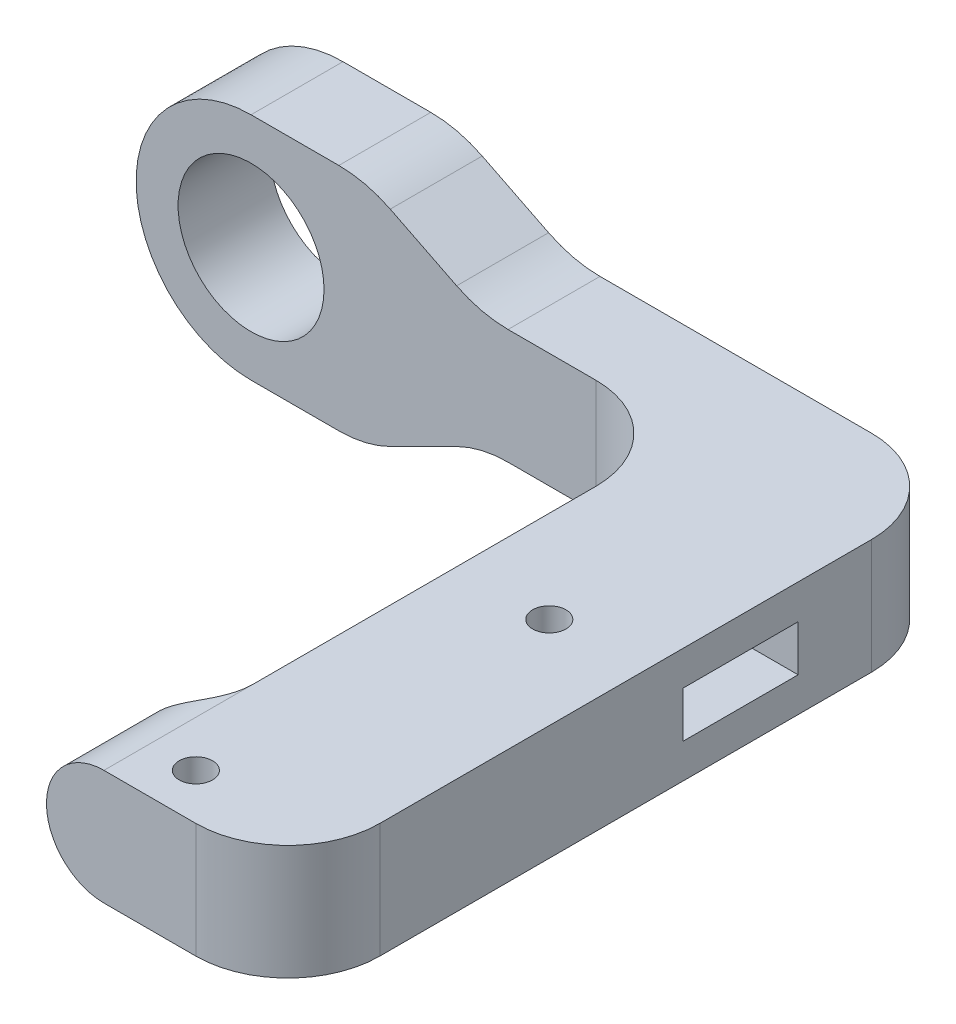
ISO-10303-21;
HEADER;
FILE_DESCRIPTION(('STEP AP214'),'2;1');
FILE_NAME('part.step','',(''),(''),'','','');
FILE_SCHEMA(('AUTOMOTIVE_DESIGN { 1 0 10303 214 1 1 1 1 }'));
ENDSEC;
DATA;
#1=APPLICATION_CONTEXT('core data for automotive mechanical design processes');
#2=APPLICATION_PROTOCOL_DEFINITION('international standard','automotive_design',2000,#1);
#3=PRODUCT_CONTEXT('',#1,'mechanical');
#4=PRODUCT('Part','Part','',(#3));
#5=PRODUCT_RELATED_PRODUCT_CATEGORY('part','',(#4));
#6=PRODUCT_DEFINITION_FORMATION('','',#4);
#7=PRODUCT_DEFINITION_CONTEXT('part definition',#1,'design');
#8=PRODUCT_DEFINITION('design','',#6,#7);
#9=PRODUCT_DEFINITION_SHAPE('','',#8);
#10=(LENGTH_UNIT() NAMED_UNIT(*) SI_UNIT(.MILLI.,.METRE.));
#11=(NAMED_UNIT(*) PLANE_ANGLE_UNIT() SI_UNIT($,.RADIAN.));
#12=(NAMED_UNIT(*) SI_UNIT($,.STERADIAN.) SOLID_ANGLE_UNIT());
#13=UNCERTAINTY_MEASURE_WITH_UNIT(LENGTH_MEASURE(1.E-05),#10,'distance_accuracy_value','');
#14=(GEOMETRIC_REPRESENTATION_CONTEXT(3) GLOBAL_UNCERTAINTY_ASSIGNED_CONTEXT((#13)) GLOBAL_UNIT_ASSIGNED_CONTEXT((#10,
#11,#12)) REPRESENTATION_CONTEXT('',''));
#15=CARTESIAN_POINT('',(0.,0.,0.));
#16=DIRECTION('',(0.,0.,1.));
#17=DIRECTION('',(1.,0.,0.));
#18=AXIS2_PLACEMENT_3D('',#15,#16,#17);
#19=CARTESIAN_POINT('',(-8.,5.,58.8));
#20=DIRECTION('',(1.,0.,0.));
#21=DIRECTION('',(0.,1.,0.));
#22=AXIS2_PLACEMENT_3D('',#19,#20,#21);
#23=PLANE('',#22);
#24=DIRECTION('',(0.,0.,-1.));
#25=VECTOR('',#24,1.);
#26=CARTESIAN_POINT('',(-8.,5.,58.8));
#27=LINE('',#26,#25);
#28=CARTESIAN_POINT('',(-8.,5.,45.8));
#29=VERTEX_POINT('',#28);
#30=CARTESIAN_POINT('',(-8.,5.,16.));
#31=VERTEX_POINT('',#30);
#32=EDGE_CURVE('E346',#29,#31,#27,.T.);
#33=ORIENTED_EDGE('',*,*,#32,.T.);
#34=DIRECTION('',(0.,1.,0.));
#35=VECTOR('',#34,1.);
#36=CARTESIAN_POINT('',(-8.,-5.,16.));
#37=LINE('',#36,#35);
#38=CARTESIAN_POINT('',(-8.,2.,16.));
#39=VERTEX_POINT('',#38);
#40=EDGE_CURVE('E564',#31,#39,#37,.F.);
#41=ORIENTED_EDGE('',*,*,#40,.T.);
#42=DIRECTION('',(0.,0.,-1.));
#43=VECTOR('',#42,1.);
#44=CARTESIAN_POINT('',(-8.,2.,14.4));
#45=LINE('',#44,#43);
#46=CARTESIAN_POINT('',(-8.,2.,24.4));
#47=VERTEX_POINT('',#46);
#48=EDGE_CURVE('E221',#47,#39,#45,.T.);
#49=ORIENTED_EDGE('',*,*,#48,.F.);
#50=DIRECTION('',(0.,1.,0.));
#51=VECTOR('',#50,1.);
#52=CARTESIAN_POINT('',(-8.,2.,24.4));
#53=LINE('',#52,#51);
#54=CARTESIAN_POINT('',(-8.,-2.,24.4));
#55=VERTEX_POINT('',#54);
#56=EDGE_CURVE('E225',#55,#47,#53,.T.);
#57=ORIENTED_EDGE('',*,*,#56,.F.);
#58=DIRECTION('',(0.,0.,1.));
#59=VECTOR('',#58,1.);
#60=CARTESIAN_POINT('',(-8.,-2.,14.4));
#61=LINE('',#60,#59);
#62=CARTESIAN_POINT('',(-8.,-2.,16.));
#63=VERTEX_POINT('',#62);
#64=EDGE_CURVE('E232',#63,#55,#61,.T.);
#65=ORIENTED_EDGE('',*,*,#64,.F.);
#66=DIRECTION('',(0.,1.,0.));
#67=VECTOR('',#66,1.);
#68=CARTESIAN_POINT('',(-8.,-5.,16.));
#69=LINE('',#68,#67);
#70=CARTESIAN_POINT('',(-8.,-5.,16.));
#71=VERTEX_POINT('',#70);
#72=EDGE_CURVE('E561',#63,#71,#69,.F.);
#73=ORIENTED_EDGE('',*,*,#72,.T.);
#74=DIRECTION('',(0.,0.,-1.));
#75=VECTOR('',#74,1.);
#76=CARTESIAN_POINT('',(-8.,-5.,58.8));
#77=LINE('',#76,#75);
#78=CARTESIAN_POINT('',(-8.,-5.,45.8));
#79=VERTEX_POINT('',#78);
#80=EDGE_CURVE('E342',#79,#71,#77,.T.);
#81=ORIENTED_EDGE('',*,*,#80,.F.);
#82=DIRECTION('',(0.,1.,0.));
#83=VECTOR('',#82,1.);
#84=CARTESIAN_POINT('',(-8.,5.,45.8));
#85=LINE('',#84,#83);
#86=EDGE_CURVE('E433',#79,#29,#85,.T.);
#87=ORIENTED_EDGE('',*,*,#86,.T.);
#88=EDGE_LOOP('',(#33,#41,#49,#57,#65,#73,#81,#87));
#89=FACE_BOUND('',#88,.T.);
#90=ADVANCED_FACE('F41',(#89),#23,.F.);
#91=CARTESIAN_POINT('',(8.,5.,58.8));
#92=DIRECTION('',(0.,-1.,0.));
#93=DIRECTION('',(1.,0.,0.));
#94=AXIS2_PLACEMENT_3D('',#91,#92,#93);
#95=PLANE('',#94);
#96=CARTESIAN_POINT('',(0.,5.,28.05));
#97=DIRECTION('',(0.,1.,0.));
#98=DIRECTION('',(-1.,0.,0.));
#99=AXIS2_PLACEMENT_3D('',#96,#97,#98);
#100=CIRCLE('',#99,1.45);
#101=CARTESIAN_POINT('',(-1.45,5.,28.05));
#102=VERTEX_POINT('',#101);
#103=EDGE_CURVE('E240',#102,#102,#100,.T.);
#104=ORIENTED_EDGE('',*,*,#103,.F.);
#105=EDGE_LOOP('',(#104));
#106=FACE_BOUND('',#105,.T.);
#107=CARTESIAN_POINT('',(-4.,5.,54.8));
#108=DIRECTION('',(0.,-1.,0.));
#109=DIRECTION('',(1.,0.,0.));
#110=AXIS2_PLACEMENT_3D('',#107,#108,#109);
#111=CIRCLE('',#110,1.45);
#112=CARTESIAN_POINT('',(-2.55,5.,54.8));
#113=VERTEX_POINT('',#112);
#114=EDGE_CURVE('E254',#113,#113,#111,.T.);
#115=ORIENTED_EDGE('',*,*,#114,.T.);
#116=EDGE_LOOP('',(#115));
#117=FACE_BOUND('',#116,.T.);
#118=DIRECTION('',(-1.,0.,0.));
#119=VECTOR('',#118,1.);
#120=CARTESIAN_POINT('',(8.,5.,0.));
#121=LINE('',#120,#119);
#122=CARTESIAN_POINT('',(0.,5.,0.));
#123=VERTEX_POINT('',#122);
#124=CARTESIAN_POINT('',(-23.6393202250021,5.,0.));
#125=VERTEX_POINT('',#124);
#126=EDGE_CURVE('E320',#123,#125,#121,.T.);
#127=ORIENTED_EDGE('',*,*,#126,.T.);
#128=DIRECTION('',(0.,0.,-1.));
#129=VECTOR('',#128,1.);
#130=CARTESIAN_POINT('',(-23.6393202250021,5.,8.));
#131=LINE('',#130,#129);
#132=CARTESIAN_POINT('',(-23.6393202250021,5.,8.));
#133=VERTEX_POINT('',#132);
#134=EDGE_CURVE('E417',#125,#133,#131,.F.);
#135=ORIENTED_EDGE('',*,*,#134,.T.);
#136=DIRECTION('',(-1.,0.,0.));
#137=VECTOR('',#136,1.);
#138=CARTESIAN_POINT('',(-26.,5.,8.));
#139=LINE('',#138,#137);
#140=CARTESIAN_POINT('',(-16.,5.,8.));
#141=VERTEX_POINT('',#140);
#142=EDGE_CURVE('E267',#141,#133,#139,.T.);
#143=ORIENTED_EDGE('',*,*,#142,.F.);
#144=CARTESIAN_POINT('',(-16.,5.,16.));
#145=DIRECTION('',(0.,-1.,0.));
#146=DIRECTION('',(1.,0.,0.));
#147=AXIS2_PLACEMENT_3D('',#144,#145,#146);
#148=CIRCLE('',#147,8.);
#149=EDGE_CURVE('E559',#141,#31,#148,.T.);
#150=ORIENTED_EDGE('',*,*,#149,.T.);
#151=ORIENTED_EDGE('',*,*,#32,.F.);
#152=CARTESIAN_POINT('',(-8.,5.,58.8));
#153=VERTEX_POINT('',#152);
#154=EDGE_CURVE('E347',#153,#29,#27,.T.);
#155=ORIENTED_EDGE('',*,*,#154,.F.);
#156=DIRECTION('',(-1.,0.,0.));
#157=VECTOR('',#156,1.);
#158=CARTESIAN_POINT('',(8.,5.,58.8));
#159=LINE('',#158,#157);
#160=CARTESIAN_POINT('',(0.,5.,58.8));
#161=VERTEX_POINT('',#160);
#162=EDGE_CURVE('E321',#161,#153,#159,.T.);
#163=ORIENTED_EDGE('',*,*,#162,.F.);
#164=CARTESIAN_POINT('',(0.,5.,50.8));
#165=DIRECTION('',(0.,-1.,0.));
#166=DIRECTION('',(1.,0.,0.));
#167=AXIS2_PLACEMENT_3D('',#164,#165,#166);
#168=CIRCLE('',#167,8.);
#169=CARTESIAN_POINT('',(8.,5.,50.8));
#170=VERTEX_POINT('',#169);
#171=EDGE_CURVE('E360',#161,#170,#168,.F.);
#172=ORIENTED_EDGE('',*,*,#171,.T.);
#173=DIRECTION('',(0.,0.,-1.));
#174=VECTOR('',#173,1.);
#175=CARTESIAN_POINT('',(8.,5.,58.8));
#176=LINE('',#175,#174);
#177=CARTESIAN_POINT('',(8.,5.,8.));
#178=VERTEX_POINT('',#177);
#179=EDGE_CURVE('E329',#170,#178,#176,.T.);
#180=ORIENTED_EDGE('',*,*,#179,.T.);
#181=CARTESIAN_POINT('',(0.,5.,8.));
#182=DIRECTION('',(0.,-1.,0.));
#183=DIRECTION('',(1.,0.,0.));
#184=AXIS2_PLACEMENT_3D('',#181,#182,#183);
#185=CIRCLE('',#184,8.);
#186=EDGE_CURVE('E363',#178,#123,#185,.F.);
#187=ORIENTED_EDGE('',*,*,#186,.T.);
#188=EDGE_LOOP('',(#127,#135,#143,#150,#151,#155,#163,#172,#180,#187));
#189=FACE_BOUND('',#188,.T.);
#190=ADVANCED_FACE('F477',(#106,#117,#189),#95,.F.);
#191=CARTESIAN_POINT('',(-8.,-5.,58.8));
#192=DIRECTION('',(0.,1.,0.));
#193=DIRECTION('',(-1.,0.,0.));
#194=AXIS2_PLACEMENT_3D('',#191,#192,#193);
#195=PLANE('',#194);
#196=CARTESIAN_POINT('',(0.,-5.,28.05));
#197=DIRECTION('',(0.,1.,0.));
#198=DIRECTION('',(-1.,0.,0.));
#199=AXIS2_PLACEMENT_3D('',#196,#197,#198);
#200=CIRCLE('',#199,1.45);
#201=CARTESIAN_POINT('',(-1.45,-5.,28.05));
#202=VERTEX_POINT('',#201);
#203=EDGE_CURVE('E249',#202,#202,#200,.T.);
#204=ORIENTED_EDGE('',*,*,#203,.T.);
#205=EDGE_LOOP('',(#204));
#206=FACE_BOUND('',#205,.T.);
#207=CARTESIAN_POINT('',(-4.,-5.,54.8));
#208=DIRECTION('',(0.,-1.,0.));
#209=DIRECTION('',(1.,0.,0.));
#210=AXIS2_PLACEMENT_3D('',#207,#208,#209);
#211=CIRCLE('',#210,1.45);
#212=CARTESIAN_POINT('',(-2.55,-5.,54.8));
#213=VERTEX_POINT('',#212);
#214=EDGE_CURVE('E250',#213,#213,#211,.T.);
#215=ORIENTED_EDGE('',*,*,#214,.F.);
#216=EDGE_LOOP('',(#215));
#217=FACE_BOUND('',#216,.T.);
#218=DIRECTION('',(1.,0.,0.));
#219=VECTOR('',#218,1.);
#220=CARTESIAN_POINT('',(-8.,-5.,8.));
#221=LINE('',#220,#219);
#222=CARTESIAN_POINT('',(-23.6393202250021,-5.,8.));
#223=VERTEX_POINT('',#222);
#224=CARTESIAN_POINT('',(-16.,-5.,8.));
#225=VERTEX_POINT('',#224);
#226=EDGE_CURVE('E289',#223,#225,#221,.T.);
#227=ORIENTED_EDGE('',*,*,#226,.F.);
#228=DIRECTION('',(0.,0.,-1.));
#229=VECTOR('',#228,1.);
#230=CARTESIAN_POINT('',(-23.6393202250021,-5.,0.));
#231=LINE('',#230,#229);
#232=CARTESIAN_POINT('',(-23.6393202250021,-5.,0.));
#233=VERTEX_POINT('',#232);
#234=EDGE_CURVE('E402',#223,#233,#231,.T.);
#235=ORIENTED_EDGE('',*,*,#234,.T.);
#236=DIRECTION('',(1.,0.,0.));
#237=VECTOR('',#236,1.);
#238=CARTESIAN_POINT('',(-8.,-5.,0.));
#239=LINE('',#238,#237);
#240=CARTESIAN_POINT('',(0.,-5.,0.));
#241=VERTEX_POINT('',#240);
#242=EDGE_CURVE('E325',#233,#241,#239,.T.);
#243=ORIENTED_EDGE('',*,*,#242,.T.);
#244=CARTESIAN_POINT('',(0.,-5.,8.));
#245=DIRECTION('',(0.,1.,0.));
#246=DIRECTION('',(-1.,0.,0.));
#247=AXIS2_PLACEMENT_3D('',#244,#245,#246);
#248=CIRCLE('',#247,8.);
#249=CARTESIAN_POINT('',(8.,-5.,8.));
#250=VERTEX_POINT('',#249);
#251=EDGE_CURVE('E373',#241,#250,#248,.F.);
#252=ORIENTED_EDGE('',*,*,#251,.T.);
#253=DIRECTION('',(0.,0.,-1.));
#254=VECTOR('',#253,1.);
#255=CARTESIAN_POINT('',(8.,-5.,58.8));
#256=LINE('',#255,#254);
#257=CARTESIAN_POINT('',(8.,-5.,50.8));
#258=VERTEX_POINT('',#257);
#259=EDGE_CURVE('E338',#258,#250,#256,.T.);
#260=ORIENTED_EDGE('',*,*,#259,.F.);
#261=CARTESIAN_POINT('',(0.,-5.,50.8));
#262=DIRECTION('',(0.,1.,0.));
#263=DIRECTION('',(-1.,0.,0.));
#264=AXIS2_PLACEMENT_3D('',#261,#262,#263);
#265=CIRCLE('',#264,8.);
#266=CARTESIAN_POINT('',(0.,-5.,58.8));
#267=VERTEX_POINT('',#266);
#268=EDGE_CURVE('E370',#258,#267,#265,.F.);
#269=ORIENTED_EDGE('',*,*,#268,.T.);
#270=DIRECTION('',(1.,0.,0.));
#271=VECTOR('',#270,1.);
#272=CARTESIAN_POINT('',(-8.,-5.,58.8));
#273=LINE('',#272,#271);
#274=CARTESIAN_POINT('',(-8.,-5.,58.8));
#275=VERTEX_POINT('',#274);
#276=EDGE_CURVE('E324',#275,#267,#273,.T.);
#277=ORIENTED_EDGE('',*,*,#276,.F.);
#278=EDGE_CURVE('E343',#275,#79,#77,.T.);
#279=ORIENTED_EDGE('',*,*,#278,.T.);
#280=ORIENTED_EDGE('',*,*,#80,.T.);
#281=CARTESIAN_POINT('',(-16.,-5.,16.));
#282=DIRECTION('',(0.,1.,0.));
#283=DIRECTION('',(-1.,0.,0.));
#284=AXIS2_PLACEMENT_3D('',#281,#282,#283);
#285=CIRCLE('',#284,8.);
#286=EDGE_CURVE('E11',#71,#225,#285,.T.);
#287=ORIENTED_EDGE('',*,*,#286,.T.);
#288=EDGE_LOOP('',(#227,#235,#243,#252,#260,#269,#277,#279,#280,#287));
#289=FACE_BOUND('',#288,.T.);
#290=ADVANCED_FACE('F474',(#206,#217,#289),#195,.F.);
#291=CARTESIAN_POINT('',(8.,-5.,58.8));
#292=DIRECTION('',(-1.,0.,0.));
#293=DIRECTION('',(0.,0.,1.));
#294=AXIS2_PLACEMENT_3D('',#291,#292,#293);
#295=PLANE('',#294);
#296=DIRECTION('',(0.,0.,-1.));
#297=VECTOR('',#296,1.);
#298=CARTESIAN_POINT('',(8.,2.,14.4));
#299=LINE('',#298,#297);
#300=CARTESIAN_POINT('',(8.,2.,24.4));
#301=VERTEX_POINT('',#300);
#302=CARTESIAN_POINT('',(8.,2.,14.4));
#303=VERTEX_POINT('',#302);
#304=EDGE_CURVE('E205',#301,#303,#299,.T.);
#305=ORIENTED_EDGE('',*,*,#304,.T.);
#306=DIRECTION('',(0.,-1.,0.));
#307=VECTOR('',#306,1.);
#308=CARTESIAN_POINT('',(8.,2.,14.4));
#309=LINE('',#308,#307);
#310=CARTESIAN_POINT('',(8.,-2.,14.4));
#311=VERTEX_POINT('',#310);
#312=EDGE_CURVE('E198',#303,#311,#309,.T.);
#313=ORIENTED_EDGE('',*,*,#312,.T.);
#314=DIRECTION('',(0.,0.,1.));
#315=VECTOR('',#314,1.);
#316=CARTESIAN_POINT('',(8.,-2.,14.4));
#317=LINE('',#316,#315);
#318=CARTESIAN_POINT('',(8.,-2.,24.4));
#319=VERTEX_POINT('',#318);
#320=EDGE_CURVE('E209',#311,#319,#317,.T.);
#321=ORIENTED_EDGE('',*,*,#320,.T.);
#322=DIRECTION('',(0.,1.,0.));
#323=VECTOR('',#322,1.);
#324=CARTESIAN_POINT('',(8.,2.,24.4));
#325=LINE('',#324,#323);
#326=EDGE_CURVE('E215',#319,#301,#325,.T.);
#327=ORIENTED_EDGE('',*,*,#326,.T.);
#328=EDGE_LOOP('',(#305,#313,#321,#327));
#329=FACE_BOUND('',#328,.T.);
#330=ORIENTED_EDGE('',*,*,#259,.T.);
#331=DIRECTION('',(0.,1.,0.));
#332=VECTOR('',#331,1.);
#333=CARTESIAN_POINT('',(8.,-5.,8.));
#334=LINE('',#333,#332);
#335=EDGE_CURVE('E356',#250,#178,#334,.T.);
#336=ORIENTED_EDGE('',*,*,#335,.T.);
#337=ORIENTED_EDGE('',*,*,#179,.F.);
#338=DIRECTION('',(0.,1.,0.));
#339=VECTOR('',#338,1.);
#340=CARTESIAN_POINT('',(8.,-5.,50.8));
#341=LINE('',#340,#339);
#342=EDGE_CURVE('E350',#170,#258,#341,.F.);
#343=ORIENTED_EDGE('',*,*,#342,.T.);
#344=EDGE_LOOP('',(#330,#336,#337,#343));
#345=FACE_BOUND('',#344,.T.);
#346=ADVANCED_FACE('F217',(#329,#345),#295,.F.);
#347=CARTESIAN_POINT('',(0.,0.,58.8));
#348=DIRECTION('',(0.,0.,1.));
#349=DIRECTION('',(1.,0.,0.));
#350=AXIS2_PLACEMENT_3D('',#347,#348,#349);
#351=PLANE('',#350);
#352=ORIENTED_EDGE('',*,*,#276,.T.);
#353=DIRECTION('',(0.,1.,0.));
#354=VECTOR('',#353,1.);
#355=CARTESIAN_POINT('',(0.,5.,58.8));
#356=LINE('',#355,#354);
#357=EDGE_CURVE('E376',#267,#161,#356,.T.);
#358=ORIENTED_EDGE('',*,*,#357,.T.);
#359=ORIENTED_EDGE('',*,*,#162,.T.);
#360=CARTESIAN_POINT('',(-8.,0.,58.8));
#361=DIRECTION('',(0.,0.,1.));
#362=DIRECTION('',(1.,0.,0.));
#363=AXIS2_PLACEMENT_3D('',#360,#361,#362);
#364=CIRCLE('',#363,5.);
#365=EDGE_CURVE('E317',#153,#275,#364,.T.);
#366=ORIENTED_EDGE('',*,*,#365,.T.);
#367=EDGE_LOOP('',(#352,#358,#359,#366));
#368=FACE_BOUND('',#367,.T.);
#369=ADVANCED_FACE('F464',(#368),#351,.T.);
#370=CARTESIAN_POINT('',(0.,0.,0.));
#371=DIRECTION('',(0.,0.,1.));
#372=DIRECTION('',(1.,0.,0.));
#373=AXIS2_PLACEMENT_3D('',#370,#371,#372);
#374=PLANE('',#373);
#375=DIRECTION('',(0.894427190999916,0.447213595499958,0.));
#376=VECTOR('',#375,1.);
#377=CARTESIAN_POINT('',(-26.,-5.,0.));
#378=LINE('',#377,#376);
#379=CARTESIAN_POINT('',(-33.8885438199983,-8.94427190999916,0.));
#380=VERTEX_POINT('',#379);
#381=CARTESIAN_POINT('',(-28.1114561800017,-6.05572809000084,0.));
#382=VERTEX_POINT('',#381);
#383=EDGE_CURVE('E271',#380,#382,#378,.T.);
#384=ORIENTED_EDGE('',*,*,#383,.F.);
#385=CARTESIAN_POINT('',(-38.3606797749979,0.,0.));
#386=DIRECTION('',(0.,0.,1.));
#387=DIRECTION('',(1.,0.,0.));
#388=AXIS2_PLACEMENT_3D('',#385,#386,#387);
#389=CIRCLE('',#388,10.);
#390=CARTESIAN_POINT('',(-38.3606797749979,-10.,0.));
#391=VERTEX_POINT('',#390);
#392=EDGE_CURVE('E390',#380,#391,#389,.F.);
#393=ORIENTED_EDGE('',*,*,#392,.T.);
#394=DIRECTION('',(1.,0.,0.));
#395=VECTOR('',#394,1.);
#396=CARTESIAN_POINT('',(-36.,-10.,0.));
#397=LINE('',#396,#395);
#398=CARTESIAN_POINT('',(-46.,-10.,0.));
#399=VERTEX_POINT('',#398);
#400=EDGE_CURVE('E303',#399,#391,#397,.T.);
#401=ORIENTED_EDGE('',*,*,#400,.F.);
#402=CARTESIAN_POINT('',(-46.,0.,0.));
#403=DIRECTION('',(0.,0.,1.));
#404=DIRECTION('',(-1.,0.,0.));
#405=AXIS2_PLACEMENT_3D('',#402,#403,#404);
#406=CIRCLE('',#405,10.);
#407=CARTESIAN_POINT('',(-46.,10.,0.));
#408=VERTEX_POINT('',#407);
#409=EDGE_CURVE('E300',#408,#399,#406,.T.);
#410=ORIENTED_EDGE('',*,*,#409,.F.);
#411=DIRECTION('',(-1.,0.,0.));
#412=VECTOR('',#411,1.);
#413=CARTESIAN_POINT('',(-46.,10.,0.));
#414=LINE('',#413,#412);
#415=CARTESIAN_POINT('',(-38.3606797749979,10.,0.));
#416=VERTEX_POINT('',#415);
#417=EDGE_CURVE('E297',#416,#408,#414,.T.);
#418=ORIENTED_EDGE('',*,*,#417,.F.);
#419=CARTESIAN_POINT('',(-38.3606797749979,0.,0.));
#420=DIRECTION('',(0.,0.,1.));
#421=DIRECTION('',(1.,0.,0.));
#422=AXIS2_PLACEMENT_3D('',#419,#420,#421);
#423=CIRCLE('',#422,10.);
#424=CARTESIAN_POINT('',(-33.8885438199983,8.94427190999916,0.));
#425=VERTEX_POINT('',#424);
#426=EDGE_CURVE('E387',#416,#425,#423,.F.);
#427=ORIENTED_EDGE('',*,*,#426,.T.);
#428=DIRECTION('',(-0.894427190999916,0.447213595499958,0.));
#429=VECTOR('',#428,1.);
#430=CARTESIAN_POINT('',(-36.,10.,0.));
#431=LINE('',#430,#429);
#432=CARTESIAN_POINT('',(-28.1114561800017,6.05572809000084,0.));
#433=VERTEX_POINT('',#432);
#434=EDGE_CURVE('E263',#433,#425,#431,.T.);
#435=ORIENTED_EDGE('',*,*,#434,.F.);
#436=CARTESIAN_POINT('',(-23.6393202250021,15.,0.));
#437=DIRECTION('',(0.,0.,1.));
#438=DIRECTION('',(1.,0.,0.));
#439=AXIS2_PLACEMENT_3D('',#436,#437,#438);
#440=CIRCLE('',#439,10.);
#441=EDGE_CURVE('E427',#433,#125,#440,.T.);
#442=ORIENTED_EDGE('',*,*,#441,.T.);
#443=ORIENTED_EDGE('',*,*,#126,.F.);
#444=DIRECTION('',(0.,1.,0.));
#445=VECTOR('',#444,1.);
#446=CARTESIAN_POINT('',(0.,0.,0.));
#447=LINE('',#446,#445);
#448=EDGE_CURVE('E366',#123,#241,#447,.F.);
#449=ORIENTED_EDGE('',*,*,#448,.T.);
#450=ORIENTED_EDGE('',*,*,#242,.F.);
#451=CARTESIAN_POINT('',(-23.6393202250021,-15.,0.));
#452=DIRECTION('',(0.,0.,1.));
#453=DIRECTION('',(1.,0.,0.));
#454=AXIS2_PLACEMENT_3D('',#451,#452,#453);
#455=CIRCLE('',#454,10.);
#456=EDGE_CURVE('E421',#233,#382,#455,.T.);
#457=ORIENTED_EDGE('',*,*,#456,.T.);
#458=EDGE_LOOP('',(#384,#393,#401,#410,#418,#427,#435,#442,#443,#449,#450,#457));
#459=FACE_BOUND('',#458,.T.);
#460=CARTESIAN_POINT('',(-46.,0.,0.));
#461=DIRECTION('',(0.,0.,1.));
#462=DIRECTION('',(1.,0.,0.));
#463=AXIS2_PLACEMENT_3D('',#460,#461,#462);
#464=CIRCLE('',#463,6.35);
#465=CARTESIAN_POINT('',(-39.65,0.,0.));
#466=VERTEX_POINT('',#465);
#467=EDGE_CURVE('E258',#466,#466,#464,.T.);
#468=ORIENTED_EDGE('',*,*,#467,.T.);
#469=EDGE_LOOP('',(#468));
#470=FACE_BOUND('',#469,.T.);
#471=ADVANCED_FACE('F460',(#459,#470),#374,.F.);
#472=CARTESIAN_POINT('',(-8.,0.,50.8));
#473=DIRECTION('',(0.,0.,1.));
#474=DIRECTION('',(1.,0.,0.));
#475=AXIS2_PLACEMENT_3D('',#472,#473,#474);
#476=CYLINDRICAL_SURFACE('',#475,5.);
#477=ORIENTED_EDGE('',*,*,#365,.F.);
#478=ORIENTED_EDGE('',*,*,#154,.T.);
#479=CARTESIAN_POINT('',(-8.,5.,45.8));
#480=CARTESIAN_POINT('',(-7.99998549865912,4.99995708928931,45.9391879787734));
#481=CARTESIAN_POINT('',(-8.00581138983767,4.99999864882734,46.0783739228776));
#482=CARTESIAN_POINT('',(-8.02903963200686,4.99994062123228,46.3557758500301));
#483=CARTESIAN_POINT('',(-8.04644191251777,4.99984103495851,46.4939918389787));
#484=CARTESIAN_POINT('',(-8.09275930521255,4.99919006365314,46.7687310698582));
#485=CARTESIAN_POINT('',(-8.12169461183642,4.9986378843255,46.905250907126));
#486=CARTESIAN_POINT('',(-8.19086848348578,4.996476137854,47.1753873611374));
#487=CARTESIAN_POINT('',(-8.23110690226101,4.99486658439107,47.3090040154209));
#488=CARTESIAN_POINT('',(-8.32264864538949,4.98978938304454,47.572530042192));
#489=CARTESIAN_POINT('',(-8.37396450241427,4.9863196239305,47.7024350253419));
#490=CARTESIAN_POINT('',(-8.48723476243144,4.97652815328975,47.9574074744933));
#491=CARTESIAN_POINT('',(-8.54918850141326,4.97020661972915,48.0824752418345));
#492=CARTESIAN_POINT('',(-8.68315966172483,4.95356877124832,48.3267119328362));
#493=CARTESIAN_POINT('',(-8.75516960927405,4.94325541306139,48.4458851490634));
#494=CARTESIAN_POINT('',(-8.90858386337488,4.91736953591812,48.6774285153913));
#495=CARTESIAN_POINT('',(-8.98998756699145,4.9017973543741,48.7897991014114));
#496=CARTESIAN_POINT('',(-9.15792167683925,4.86480378516127,49.0025106218988));
#497=CARTESIAN_POINT('',(-9.24412940638407,4.84363353690537,49.1031494887471));
#498=CARTESIAN_POINT('',(-9.42328020163076,4.79404906757774,49.2963444735722));
#499=CARTESIAN_POINT('',(-9.51622311302345,4.76563501243073,49.3889007766207));
#500=CARTESIAN_POINT('',(-9.70736024185754,4.70054216638891,49.5650218148149));
#501=CARTESIAN_POINT('',(-9.80554764526215,4.66387390989617,49.6485978119416));
#502=CARTESIAN_POINT('',(-10.0056361856532,4.58138854271999,49.8062449254303));
#503=CARTESIAN_POINT('',(-10.1075366737801,4.53557302430703,49.8803176923454));
#504=CARTESIAN_POINT('',(-10.2991617243025,4.44113303338272,50.0091490334789));
#505=CARTESIAN_POINT('',(-10.3886532003845,4.39374216508619,50.0651640543257));
#506=CARTESIAN_POINT('',(-10.5677399064932,4.29154236529258,50.1697667219308));
#507=CARTESIAN_POINT('',(-10.6573351302206,4.23673386293922,50.2183547980254));
#508=CARTESIAN_POINT('',(-10.8353474522524,4.11972699368197,50.3082397204842));
#509=CARTESIAN_POINT('',(-10.9237645166673,4.05752841471128,50.3495363575274));
#510=CARTESIAN_POINT('',(-11.0981974394701,3.92595291858719,50.4251687234696));
#511=CARTESIAN_POINT('',(-11.1842132837869,3.85657595937933,50.4595044115843));
#512=CARTESIAN_POINT('',(-11.3478218826094,3.71525064571076,50.51990104921));
#513=CARTESIAN_POINT('',(-11.4256134585556,3.64368725115055,50.5463274091128));
#514=CARTESIAN_POINT('',(-11.5773018258489,3.49488245998301,50.5939809302777));
#515=CARTESIAN_POINT('',(-11.6511973650553,3.41763925682175,50.6152064279413));
#516=CARTESIAN_POINT('',(-11.794368300347,3.25795449384787,50.6530336014394));
#517=CARTESIAN_POINT('',(-11.8636446089345,3.17551396703402,50.6696361925727));
#518=CARTESIAN_POINT('',(-11.9970545396344,3.00586200428445,50.6988535509665));
#519=CARTESIAN_POINT('',(-12.0611862797283,2.91864884184294,50.7114668637648));
#520=CARTESIAN_POINT('',(-12.1898665571314,2.73115121408323,50.7344064746668));
#521=CARTESIAN_POINT('',(-12.2538341560647,2.63042531223544,50.7443852138641));
#522=CARTESIAN_POINT('',(-12.3745249511924,2.42441584466993,50.7610981799036));
#523=CARTESIAN_POINT('',(-12.4312449482745,2.31913029357588,50.767830977589));
#524=CARTESIAN_POINT('',(-12.5370635071989,2.10460607417449,50.778807276559));
#525=CARTESIAN_POINT('',(-12.5861580592973,1.99536536307359,50.7830494714289));
#526=CARTESIAN_POINT('',(-12.6763984031589,1.77359308457622,50.7897223113021));
#527=CARTESIAN_POINT('',(-12.7175437095436,1.66106131671164,50.7921528457119));
#528=CARTESIAN_POINT('',(-12.7951642259386,1.4225268270473,50.7959680839854));
#529=CARTESIAN_POINT('',(-12.8308283041114,1.29625752473594,50.7972319650804));
#530=CARTESIAN_POINT('',(-12.8921266534371,1.0412939494122,50.7989296006095));
#531=CARTESIAN_POINT('',(-12.9177600314134,0.912599461519848,50.7993632811324));
#532=CARTESIAN_POINT('',(-12.9588208606717,0.653653996306247,50.7998750748702));
#533=CARTESIAN_POINT('',(-12.9742531266453,0.523403782847282,50.7999533559281));
#534=CARTESIAN_POINT('',(-12.9948481131185,0.262102720855087,50.7999989093315));
#535=CARTESIAN_POINT('',(-13.000011504189,0.131051925161548,50.7999661889261));
#536=CARTESIAN_POINT('',(-13.,0.,50.8));
#537=B_SPLINE_CURVE_WITH_KNOTS('',3,(#479,#480,#481,#482,#483,#484,#485,#486,#487,#488,#489,
#490,#491,#492,#493,#494,#495,#496,#497,#498,#499,#500,#501,#502,#503,#504,#505,#506,#507,#508,
#509,#510,#511,#512,#513,#514,#515,#516,#517,#518,#519,#520,#521,#522,#523,#524,#525,#526,#527,
#528,#529,#530,#531,#532,#533,#534,#535,#536),.UNSPECIFIED.,.F.,.F.,(4,2,2,2,2,2,2,2,2,2,2,2,2,
2,2,2,2,2,2,2,2,2,2,2,2,2,2,2,4),(0.,0.417439173640649,0.834875805838476,1.25304660748524,
1.67121199869516,2.08985299230127,2.50846786406668,2.92677326051622,3.34505182309423,
3.7470569021807,4.14905277387271,4.55053847926641,4.95195435859015,5.29866782167456,
5.6453612343828,5.99206459826368,6.33876999341715,6.66528709743992,6.99190850845819,
7.31846520496783,7.64514082481225,8.00398786203719,8.36299275219284,8.72218578604451,
9.08140074517575,9.47462987042457,9.86789400252029,10.260972390156,10.6540251084155),.UNSPECIFIED.);
#538=CARTESIAN_POINT('',(-13.,0.,50.8));
#539=VERTEX_POINT('',#538);
#540=EDGE_CURVE('E437',#29,#539,#537,.T.);
#541=ORIENTED_EDGE('',*,*,#540,.T.);
#542=CARTESIAN_POINT('',(-13.,0.,50.8));
#543=CARTESIAN_POINT('',(-13.0000145013409,-0.139187978773442,50.7999570892893));
#544=CARTESIAN_POINT('',(-12.9941886101623,-0.278373922877595,50.7999986488273));
#545=CARTESIAN_POINT('',(-12.9709603679931,-0.555775850030138,50.7999406212323));
#546=CARTESIAN_POINT('',(-12.9535580874822,-0.693991838978662,50.7998410349585));
#547=CARTESIAN_POINT('',(-12.9072406947875,-0.968731069858211,50.7991900636531));
#548=CARTESIAN_POINT('',(-12.8783053881636,-1.10525090712604,50.7986378843255));
#549=CARTESIAN_POINT('',(-12.8091315165142,-1.37538736113736,50.796476137854));
#550=CARTESIAN_POINT('',(-12.768893097739,-1.50900401542087,50.7948665843911));
#551=CARTESIAN_POINT('',(-12.6773513546105,-1.77253004219206,50.7897893830445));
#552=CARTESIAN_POINT('',(-12.6260354975857,-1.90243502534188,50.7863196239305));
#553=CARTESIAN_POINT('',(-12.5127652375686,-2.1574074744933,50.7765281532898));
#554=CARTESIAN_POINT('',(-12.4508114985867,-2.2824752418345,50.7702066197292));
#555=CARTESIAN_POINT('',(-12.3168403382752,-2.52671193283625,50.7535687712483));
#556=CARTESIAN_POINT('',(-12.2448303907259,-2.64588514906344,50.7432554130614));
#557=CARTESIAN_POINT('',(-12.0914161366251,-2.87742851539129,50.7173695359181));
#558=CARTESIAN_POINT('',(-12.0100124330085,-2.98979910141141,50.7017973543741));
#559=CARTESIAN_POINT('',(-11.8420783231607,-3.20251062189879,50.6648037851613));
#560=CARTESIAN_POINT('',(-11.7558705936159,-3.30314948874713,50.6436335369054));
#561=CARTESIAN_POINT('',(-11.5767197983692,-3.49634447357216,50.5940490675777));
#562=CARTESIAN_POINT('',(-11.4837768869765,-3.58890077662073,50.5656350124307));
#563=CARTESIAN_POINT('',(-11.2926397581424,-3.76502181481488,50.5005421663889));
#564=CARTESIAN_POINT('',(-11.1944523547378,-3.84859781194161,50.4638739098962));
#565=CARTESIAN_POINT('',(-10.9943638143468,-4.00624492543028,50.38138854272));
#566=CARTESIAN_POINT('',(-10.8924633262199,-4.0803176923454,50.335573024307));
#567=CARTESIAN_POINT('',(-10.7008382756975,-4.20914903347894,50.2411330333827));
#568=CARTESIAN_POINT('',(-10.6113467996155,-4.2651640543257,50.1937421650862));
#569=CARTESIAN_POINT('',(-10.4322600935068,-4.36976672193076,50.0915423652926));
#570=CARTESIAN_POINT('',(-10.3426648697794,-4.41835479802541,50.0367338629392));
#571=CARTESIAN_POINT('',(-10.1646525477476,-4.50823972048417,49.919726993682));
#572=CARTESIAN_POINT('',(-10.0762354833327,-4.54953635752743,49.8575284147113));
#573=CARTESIAN_POINT('',(-9.90180256052984,-4.62516872346956,49.7259529185872));
#574=CARTESIAN_POINT('',(-9.81578671621309,-4.65950441158431,49.6565759593793));
#575=CARTESIAN_POINT('',(-9.65217811739055,-4.71990104921,49.5152506457108));
#576=CARTESIAN_POINT('',(-9.57438654144443,-4.7463274091128,49.4436872511505));
#577=CARTESIAN_POINT('',(-9.42269817415108,-4.79398093027769,49.294882459983));
#578=CARTESIAN_POINT('',(-9.34880263494467,-4.81520642794132,49.2176392568218));
#579=CARTESIAN_POINT('',(-9.20563169965302,-4.8530336014394,49.0579544938479));
#580=CARTESIAN_POINT('',(-9.13635539106547,-4.86963619257271,48.975513967034));
#581=CARTESIAN_POINT('',(-9.00294546036562,-4.8988535509665,48.8058620042844));
#582=CARTESIAN_POINT('',(-8.93881372027166,-4.91146686376484,48.7186488418429));
#583=CARTESIAN_POINT('',(-8.81013344286855,-4.93440647466678,48.5311512140832));
#584=CARTESIAN_POINT('',(-8.74616584393531,-4.94438521386408,48.4304253122354));
#585=CARTESIAN_POINT('',(-8.62547504880763,-4.96109817990359,48.2244158446699));
#586=CARTESIAN_POINT('',(-8.56875505172549,-4.96783097758898,48.1191302935759));
#587=CARTESIAN_POINT('',(-8.46293649280113,-4.97880727655903,47.9046060741745));
#588=CARTESIAN_POINT('',(-8.41384194070265,-4.98304947142894,47.7953653630736));
#589=CARTESIAN_POINT('',(-8.32360159684113,-4.98972231130214,47.5735930845762));
#590=CARTESIAN_POINT('',(-8.28245629045636,-4.99215284571193,47.4610613167116));
#591=CARTESIAN_POINT('',(-8.20483577406137,-4.9959680839854,47.2225268270473));
#592=CARTESIAN_POINT('',(-8.16917169588858,-4.99723196508038,47.0962575247359));
#593=CARTESIAN_POINT('',(-8.1078733465629,-4.9989296006095,46.8412939494122));
#594=CARTESIAN_POINT('',(-8.08223996858662,-4.99936328113241,46.7125994615199));
#595=CARTESIAN_POINT('',(-8.04117913932832,-4.99987507487021,46.4536539963063));
#596=CARTESIAN_POINT('',(-8.02574687335466,-4.99995335592806,46.3234037828473));
#597=CARTESIAN_POINT('',(-8.00515188688148,-4.99999890933154,46.0621027208551));
#598=CARTESIAN_POINT('',(-7.99998849581099,-4.99996618892609,45.9310519251616));
#599=CARTESIAN_POINT('',(-8.,-5.,45.8));
#600=B_SPLINE_CURVE_WITH_KNOTS('',3,(#542,#543,#544,#545,#546,#547,#548,#549,#550,#551,#552,
#553,#554,#555,#556,#557,#558,#559,#560,#561,#562,#563,#564,#565,#566,#567,#568,#569,#570,#571,
#572,#573,#574,#575,#576,#577,#578,#579,#580,#581,#582,#583,#584,#585,#586,#587,#588,#589,#590,
#591,#592,#593,#594,#595,#596,#597,#598,#599),.UNSPECIFIED.,.F.,.F.,(4,2,2,2,2,2,2,2,2,2,2,2,2,
2,2,2,2,2,2,2,2,2,2,2,2,2,2,2,4),(0.,0.417439173640644,0.834875805838472,1.25304660748524,
1.67121199869517,2.08985299230128,2.50846786406669,2.92677326051623,3.34505182309424,
3.74705690218071,4.14905277387272,4.55053847926642,4.95195435859016,5.29866782167455,
5.64536123438281,5.9920645982637,6.33876999341716,6.66528709743992,6.9919085084582,
7.31846520496784,7.64514082481226,8.00398786203721,8.36299275219285,8.72218578604452,
9.08140074517576,9.47462987042457,9.86789400252029,10.2609723901561,10.6540251084155),.UNSPECIFIED.);
#601=EDGE_CURVE('E445',#539,#79,#600,.T.);
#602=ORIENTED_EDGE('',*,*,#601,.T.);
#603=ORIENTED_EDGE('',*,*,#278,.F.);
#604=EDGE_LOOP('',(#477,#478,#541,#602,#603));
#605=FACE_BOUND('',#604,.T.);
#606=ADVANCED_FACE('F454',(#605),#476,.T.);
#607=CARTESIAN_POINT('',(-46.,0.,8.));
#608=DIRECTION('',(0.,0.,-1.));
#609=DIRECTION('',(-1.,0.,0.));
#610=AXIS2_PLACEMENT_3D('',#607,#608,#609);
#611=PLANE('',#610);
#612=ORIENTED_EDGE('',*,*,#226,.T.);
#613=DIRECTION('',(0.,1.,0.));
#614=VECTOR('',#613,1.);
#615=CARTESIAN_POINT('',(-16.,5.,8.));
#616=LINE('',#615,#614);
#617=EDGE_CURVE('E554',#225,#141,#616,.T.);
#618=ORIENTED_EDGE('',*,*,#617,.T.);
#619=ORIENTED_EDGE('',*,*,#142,.T.);
#620=CARTESIAN_POINT('',(-23.6393202250021,15.,8.));
#621=DIRECTION('',(0.,0.,-1.));
#622=DIRECTION('',(-1.,0.,0.));
#623=AXIS2_PLACEMENT_3D('',#620,#621,#622);
#624=CIRCLE('',#623,10.);
#625=CARTESIAN_POINT('',(-28.1114561800017,6.05572809000084,8.));
#626=VERTEX_POINT('',#625);
#627=EDGE_CURVE('E430',#133,#626,#624,.T.);
#628=ORIENTED_EDGE('',*,*,#627,.T.);
#629=DIRECTION('',(-0.894427190999916,0.447213595499958,0.));
#630=VECTOR('',#629,1.);
#631=CARTESIAN_POINT('',(-36.,10.,8.));
#632=LINE('',#631,#630);
#633=CARTESIAN_POINT('',(-33.8885438199983,8.94427190999916,8.));
#634=VERTEX_POINT('',#633);
#635=EDGE_CURVE('E270',#626,#634,#632,.T.);
#636=ORIENTED_EDGE('',*,*,#635,.T.);
#637=CARTESIAN_POINT('',(-38.3606797749979,0.,8.));
#638=DIRECTION('',(0.,0.,-1.));
#639=DIRECTION('',(-1.,0.,0.));
#640=AXIS2_PLACEMENT_3D('',#637,#638,#639);
#641=CIRCLE('',#640,10.);
#642=CARTESIAN_POINT('',(-38.3606797749979,10.,8.));
#643=VERTEX_POINT('',#642);
#644=EDGE_CURVE('E396',#634,#643,#641,.F.);
#645=ORIENTED_EDGE('',*,*,#644,.T.);
#646=DIRECTION('',(-1.,0.,0.));
#647=VECTOR('',#646,1.);
#648=CARTESIAN_POINT('',(-46.,10.,8.));
#649=LINE('',#648,#647);
#650=CARTESIAN_POINT('',(-46.,10.,8.));
#651=VERTEX_POINT('',#650);
#652=EDGE_CURVE('E275',#643,#651,#649,.T.);
#653=ORIENTED_EDGE('',*,*,#652,.T.);
#654=CARTESIAN_POINT('',(-46.,0.,8.));
#655=DIRECTION('',(0.,0.,1.));
#656=DIRECTION('',(-1.,0.,0.));
#657=AXIS2_PLACEMENT_3D('',#654,#655,#656);
#658=CIRCLE('',#657,10.);
#659=CARTESIAN_POINT('',(-46.,-10.,8.));
#660=VERTEX_POINT('',#659);
#661=EDGE_CURVE('E278',#651,#660,#658,.T.);
#662=ORIENTED_EDGE('',*,*,#661,.T.);
#663=DIRECTION('',(1.,0.,0.));
#664=VECTOR('',#663,1.);
#665=CARTESIAN_POINT('',(-36.,-10.,8.));
#666=LINE('',#665,#664);
#667=CARTESIAN_POINT('',(-38.3606797749979,-10.,8.));
#668=VERTEX_POINT('',#667);
#669=EDGE_CURVE('E281',#660,#668,#666,.T.);
#670=ORIENTED_EDGE('',*,*,#669,.T.);
#671=CARTESIAN_POINT('',(-38.3606797749979,0.,8.));
#672=DIRECTION('',(0.,0.,-1.));
#673=DIRECTION('',(-1.,0.,0.));
#674=AXIS2_PLACEMENT_3D('',#671,#672,#673);
#675=CIRCLE('',#674,10.);
#676=CARTESIAN_POINT('',(-33.8885438199983,-8.94427190999916,8.));
#677=VERTEX_POINT('',#676);
#678=EDGE_CURVE('E399',#668,#677,#675,.F.);
#679=ORIENTED_EDGE('',*,*,#678,.T.);
#680=DIRECTION('',(0.894427190999916,0.447213595499958,0.));
#681=VECTOR('',#680,1.);
#682=CARTESIAN_POINT('',(-26.,-5.,8.));
#683=LINE('',#682,#681);
#684=CARTESIAN_POINT('',(-28.1114561800017,-6.05572809000084,8.));
#685=VERTEX_POINT('',#684);
#686=EDGE_CURVE('E285',#677,#685,#683,.T.);
#687=ORIENTED_EDGE('',*,*,#686,.T.);
#688=CARTESIAN_POINT('',(-23.6393202250021,-15.,8.));
#689=DIRECTION('',(0.,0.,-1.));
#690=DIRECTION('',(-1.,0.,0.));
#691=AXIS2_PLACEMENT_3D('',#688,#689,#690);
#692=CIRCLE('',#691,10.);
#693=EDGE_CURVE('E424',#685,#223,#692,.T.);
#694=ORIENTED_EDGE('',*,*,#693,.T.);
#695=EDGE_LOOP('',(#612,#618,#619,#628,#636,#645,#653,#662,#670,#679,#687,#694));
#696=FACE_BOUND('',#695,.T.);
#697=CARTESIAN_POINT('',(-46.,0.,8.));
#698=DIRECTION('',(0.,0.,1.));
#699=DIRECTION('',(1.,0.,0.));
#700=AXIS2_PLACEMENT_3D('',#697,#698,#699);
#701=CIRCLE('',#700,6.35);
#702=CARTESIAN_POINT('',(-39.65,0.,8.));
#703=VERTEX_POINT('',#702);
#704=EDGE_CURVE('E259',#703,#703,#701,.T.);
#705=ORIENTED_EDGE('',*,*,#704,.F.);
#706=EDGE_LOOP('',(#705));
#707=FACE_BOUND('',#706,.T.);
#708=ADVANCED_FACE('F459',(#696,#707),#611,.F.);
#709=CARTESIAN_POINT('',(-36.,10.,8.));
#710=DIRECTION('',(-0.447213595499958,-0.894427190999916,0.));
#711=DIRECTION('',(0.894427190999916,-0.447213595499958,0.));
#712=AXIS2_PLACEMENT_3D('',#709,#710,#711);
#713=PLANE('',#712);
#714=ORIENTED_EDGE('',*,*,#434,.T.);
#715=DIRECTION('',(0.,0.,-1.));
#716=VECTOR('',#715,1.);
#717=CARTESIAN_POINT('',(-33.8885438199983,8.94427190999916,8.));
#718=LINE('',#717,#716);
#719=EDGE_CURVE('E414',#425,#634,#718,.F.);
#720=ORIENTED_EDGE('',*,*,#719,.T.);
#721=ORIENTED_EDGE('',*,*,#635,.F.);
#722=DIRECTION('',(0.,0.,-1.));
#723=VECTOR('',#722,1.);
#724=CARTESIAN_POINT('',(-28.1114561800017,6.05572809000084,0.));
#725=LINE('',#724,#723);
#726=EDGE_CURVE('E410',#626,#433,#725,.T.);
#727=ORIENTED_EDGE('',*,*,#726,.T.);
#728=EDGE_LOOP('',(#714,#720,#721,#727));
#729=FACE_BOUND('',#728,.T.);
#730=ADVANCED_FACE('F462',(#729),#713,.F.);
#731=CARTESIAN_POINT('',(-46.,10.,8.));
#732=DIRECTION('',(0.,-1.,0.));
#733=DIRECTION('',(0.,0.,-1.));
#734=AXIS2_PLACEMENT_3D('',#731,#732,#733);
#735=PLANE('',#734);
#736=ORIENTED_EDGE('',*,*,#652,.F.);
#737=DIRECTION('',(0.,0.,-1.));
#738=VECTOR('',#737,1.);
#739=CARTESIAN_POINT('',(-38.3606797749979,10.,8.));
#740=LINE('',#739,#738);
#741=EDGE_CURVE('E406',#643,#416,#740,.T.);
#742=ORIENTED_EDGE('',*,*,#741,.T.);
#743=ORIENTED_EDGE('',*,*,#417,.T.);
#744=DIRECTION('',(0.,0.,-1.));
#745=VECTOR('',#744,1.);
#746=CARTESIAN_POINT('',(-46.,10.,8.));
#747=LINE('',#746,#745);
#748=EDGE_CURVE('E313',#651,#408,#747,.T.);
#749=ORIENTED_EDGE('',*,*,#748,.F.);
#750=EDGE_LOOP('',(#736,#742,#743,#749));
#751=FACE_BOUND('',#750,.T.);
#752=ADVANCED_FACE('F527',(#751),#735,.F.);
#753=CARTESIAN_POINT('',(-46.,0.,8.));
#754=DIRECTION('',(0.,0.,-1.));
#755=DIRECTION('',(-1.,0.,0.));
#756=AXIS2_PLACEMENT_3D('',#753,#754,#755);
#757=CYLINDRICAL_SURFACE('',#756,10.);
#758=ORIENTED_EDGE('',*,*,#409,.T.);
#759=DIRECTION('',(0.,0.,-1.));
#760=VECTOR('',#759,1.);
#761=CARTESIAN_POINT('',(-46.,-10.,8.));
#762=LINE('',#761,#760);
#763=EDGE_CURVE('E293',#660,#399,#762,.T.);
#764=ORIENTED_EDGE('',*,*,#763,.F.);
#765=ORIENTED_EDGE('',*,*,#661,.F.);
#766=ORIENTED_EDGE('',*,*,#748,.T.);
#767=EDGE_LOOP('',(#758,#764,#765,#766));
#768=FACE_BOUND('',#767,.T.);
#769=ADVANCED_FACE('F533',(#768),#757,.T.);
#770=CARTESIAN_POINT('',(-36.,-10.,8.));
#771=DIRECTION('',(0.,1.,0.));
#772=DIRECTION('',(-1.,0.,0.));
#773=AXIS2_PLACEMENT_3D('',#770,#771,#772);
#774=PLANE('',#773);
#775=ORIENTED_EDGE('',*,*,#400,.T.);
#776=DIRECTION('',(0.,0.,-1.));
#777=VECTOR('',#776,1.);
#778=CARTESIAN_POINT('',(-38.3606797749979,-10.,8.));
#779=LINE('',#778,#777);
#780=EDGE_CURVE('E393',#391,#668,#779,.F.);
#781=ORIENTED_EDGE('',*,*,#780,.T.);
#782=ORIENTED_EDGE('',*,*,#669,.F.);
#783=ORIENTED_EDGE('',*,*,#763,.T.);
#784=EDGE_LOOP('',(#775,#781,#782,#783));
#785=FACE_BOUND('',#784,.T.);
#786=ADVANCED_FACE('F607',(#785),#774,.F.);
#787=CARTESIAN_POINT('',(-26.,-5.,8.));
#788=DIRECTION('',(-0.447213595499958,0.894427190999916,0.));
#789=DIRECTION('',(-0.894427190999916,-0.447213595499958,0.));
#790=AXIS2_PLACEMENT_3D('',#787,#788,#789);
#791=PLANE('',#790);
#792=ORIENTED_EDGE('',*,*,#686,.F.);
#793=DIRECTION('',(0.,0.,-1.));
#794=VECTOR('',#793,1.);
#795=CARTESIAN_POINT('',(-33.8885438199983,-8.94427190999916,8.));
#796=LINE('',#795,#794);
#797=EDGE_CURVE('E383',#677,#380,#796,.T.);
#798=ORIENTED_EDGE('',*,*,#797,.T.);
#799=ORIENTED_EDGE('',*,*,#383,.T.);
#800=DIRECTION('',(0.,0.,-1.));
#801=VECTOR('',#800,1.);
#802=CARTESIAN_POINT('',(-28.1114561800017,-6.05572809000084,8.));
#803=LINE('',#802,#801);
#804=EDGE_CURVE('E380',#382,#685,#803,.F.);
#805=ORIENTED_EDGE('',*,*,#804,.T.);
#806=EDGE_LOOP('',(#792,#798,#799,#805));
#807=FACE_BOUND('',#806,.T.);
#808=ADVANCED_FACE('F542',(#807),#791,.F.);
#809=CARTESIAN_POINT('',(-46.,0.,8.));
#810=DIRECTION('',(0.,0.,-1.));
#811=DIRECTION('',(-1.,0.,0.));
#812=AXIS2_PLACEMENT_3D('',#809,#810,#811);
#813=CYLINDRICAL_SURFACE('',#812,6.35);
#814=ORIENTED_EDGE('',*,*,#704,.T.);
#815=EDGE_LOOP('',(#814));
#816=FACE_BOUND('',#815,.T.);
#817=ORIENTED_EDGE('',*,*,#467,.F.);
#818=EDGE_LOOP('',(#817));
#819=FACE_BOUND('',#818,.T.);
#820=ADVANCED_FACE('F614',(#816,#819),#813,.F.);
#821=CARTESIAN_POINT('',(-4.,10.,54.8));
#822=DIRECTION('',(0.,-1.,0.));
#823=DIRECTION('',(1.,0.,0.));
#824=AXIS2_PLACEMENT_3D('',#821,#822,#823);
#825=CYLINDRICAL_SURFACE('',#824,1.45);
#826=ORIENTED_EDGE('',*,*,#214,.T.);
#827=EDGE_LOOP('',(#826));
#828=FACE_BOUND('',#827,.T.);
#829=ORIENTED_EDGE('',*,*,#114,.F.);
#830=EDGE_LOOP('',(#829));
#831=FACE_BOUND('',#830,.T.);
#832=ADVANCED_FACE('F630',(#828,#831),#825,.F.);
#833=CARTESIAN_POINT('',(0.,-10.,28.05));
#834=DIRECTION('',(0.,1.,0.));
#835=DIRECTION('',(-1.,0.,0.));
#836=AXIS2_PLACEMENT_3D('',#833,#834,#835);
#837=CYLINDRICAL_SURFACE('',#836,1.45);
#838=ORIENTED_EDGE('',*,*,#103,.T.);
#839=EDGE_LOOP('',(#838));
#840=FACE_BOUND('',#839,.T.);
#841=ORIENTED_EDGE('',*,*,#203,.F.);
#842=EDGE_LOOP('',(#841));
#843=FACE_BOUND('',#842,.T.);
#844=ADVANCED_FACE('F634',(#840,#843),#837,.F.);
#845=CARTESIAN_POINT('',(8.,2.,14.4));
#846=DIRECTION('',(0.,0.,-1.));
#847=DIRECTION('',(-1.,0.,0.));
#848=AXIS2_PLACEMENT_3D('',#845,#846,#847);
#849=PLANE('',#848);
#850=DIRECTION('',(-1.,0.,0.));
#851=VECTOR('',#850,1.);
#852=CARTESIAN_POINT('',(8.,2.,14.4));
#853=LINE('',#852,#851);
#854=CARTESIAN_POINT('',(-8.16163282309383,2.,14.4));
#855=VERTEX_POINT('',#854);
#856=EDGE_CURVE('E64',#303,#855,#853,.T.);
#857=ORIENTED_EDGE('',*,*,#856,.T.);
#858=DIRECTION('',(0.,-1.,0.));
#859=VECTOR('',#858,1.);
#860=CARTESIAN_POINT('',(-8.16163282309383,2.,14.4));
#861=LINE('',#860,#859);
#862=CARTESIAN_POINT('',(-8.16163282309383,-2.,14.4));
#863=VERTEX_POINT('',#862);
#864=EDGE_CURVE('E201',#855,#863,#861,.T.);
#865=ORIENTED_EDGE('',*,*,#864,.T.);
#866=DIRECTION('',(-1.,0.,0.));
#867=VECTOR('',#866,1.);
#868=CARTESIAN_POINT('',(8.,-2.,14.4));
#869=LINE('',#868,#867);
#870=EDGE_CURVE('E57',#311,#863,#869,.T.);
#871=ORIENTED_EDGE('',*,*,#870,.F.);
#872=ORIENTED_EDGE('',*,*,#312,.F.);
#873=EDGE_LOOP('',(#857,#865,#871,#872));
#874=FACE_BOUND('',#873,.T.);
#875=ADVANCED_FACE('F196',(#874),#849,.F.);
#876=CARTESIAN_POINT('',(8.,2.,14.4));
#877=DIRECTION('',(0.,1.,0.));
#878=DIRECTION('',(-1.,0.,0.));
#879=AXIS2_PLACEMENT_3D('',#876,#877,#878);
#880=PLANE('',#879);
#881=ORIENTED_EDGE('',*,*,#48,.T.);
#882=CARTESIAN_POINT('',(-16.,2.,16.));
#883=DIRECTION('',(0.,1.,0.));
#884=DIRECTION('',(-1.,0.,0.));
#885=AXIS2_PLACEMENT_3D('',#882,#883,#884);
#886=CIRCLE('',#885,8.);
#887=EDGE_CURVE('E572',#39,#855,#886,.T.);
#888=ORIENTED_EDGE('',*,*,#887,.T.);
#889=ORIENTED_EDGE('',*,*,#856,.F.);
#890=ORIENTED_EDGE('',*,*,#304,.F.);
#891=DIRECTION('',(-1.,0.,0.));
#892=VECTOR('',#891,1.);
#893=CARTESIAN_POINT('',(8.,2.,24.4));
#894=LINE('',#893,#892);
#895=EDGE_CURVE('E241',#301,#47,#894,.T.);
#896=ORIENTED_EDGE('',*,*,#895,.T.);
#897=EDGE_LOOP('',(#881,#888,#889,#890,#896));
#898=FACE_BOUND('',#897,.T.);
#899=ADVANCED_FACE('F585',(#898),#880,.F.);
#900=CARTESIAN_POINT('',(8.,2.,24.4));
#901=DIRECTION('',(0.,0.,1.));
#902=DIRECTION('',(1.,0.,0.));
#903=AXIS2_PLACEMENT_3D('',#900,#901,#902);
#904=PLANE('',#903);
#905=ORIENTED_EDGE('',*,*,#56,.T.);
#906=ORIENTED_EDGE('',*,*,#895,.F.);
#907=ORIENTED_EDGE('',*,*,#326,.F.);
#908=DIRECTION('',(-1.,0.,0.));
#909=VECTOR('',#908,1.);
#910=CARTESIAN_POINT('',(8.,-2.,24.4));
#911=LINE('',#910,#909);
#912=EDGE_CURVE('E204',#319,#55,#911,.T.);
#913=ORIENTED_EDGE('',*,*,#912,.T.);
#914=EDGE_LOOP('',(#905,#906,#907,#913));
#915=FACE_BOUND('',#914,.T.);
#916=ADVANCED_FACE('F583',(#915),#904,.F.);
#917=CARTESIAN_POINT('',(8.,-2.,14.4));
#918=DIRECTION('',(0.,-1.,0.));
#919=DIRECTION('',(1.,0.,0.));
#920=AXIS2_PLACEMENT_3D('',#917,#918,#919);
#921=PLANE('',#920);
#922=ORIENTED_EDGE('',*,*,#870,.T.);
#923=CARTESIAN_POINT('',(-16.,-2.,16.));
#924=DIRECTION('',(0.,-1.,0.));
#925=DIRECTION('',(1.,0.,0.));
#926=AXIS2_PLACEMENT_3D('',#923,#924,#925);
#927=CIRCLE('',#926,8.);
#928=EDGE_CURVE('E50',#863,#63,#927,.T.);
#929=ORIENTED_EDGE('',*,*,#928,.T.);
#930=ORIENTED_EDGE('',*,*,#64,.T.);
#931=ORIENTED_EDGE('',*,*,#912,.F.);
#932=ORIENTED_EDGE('',*,*,#320,.F.);
#933=EDGE_LOOP('',(#922,#929,#930,#931,#932));
#934=FACE_BOUND('',#933,.T.);
#935=ADVANCED_FACE('F210',(#934),#921,.F.);
#936=CARTESIAN_POINT('',(0.,-5.,8.));
#937=DIRECTION('',(0.,1.,0.));
#938=DIRECTION('',(0.,0.,1.));
#939=AXIS2_PLACEMENT_3D('',#936,#937,#938);
#940=CYLINDRICAL_SURFACE('',#939,8.);
#941=ORIENTED_EDGE('',*,*,#251,.F.);
#942=ORIENTED_EDGE('',*,*,#448,.F.);
#943=ORIENTED_EDGE('',*,*,#186,.F.);
#944=ORIENTED_EDGE('',*,*,#335,.F.);
#945=EDGE_LOOP('',(#941,#942,#943,#944));
#946=FACE_BOUND('',#945,.T.);
#947=ADVANCED_FACE('F485',(#946),#940,.T.);
#948=CARTESIAN_POINT('',(0.,0.,50.8));
#949=DIRECTION('',(0.,-1.,0.));
#950=DIRECTION('',(0.,0.,-1.));
#951=AXIS2_PLACEMENT_3D('',#948,#949,#950);
#952=CYLINDRICAL_SURFACE('',#951,8.);
#953=ORIENTED_EDGE('',*,*,#268,.F.);
#954=ORIENTED_EDGE('',*,*,#342,.F.);
#955=ORIENTED_EDGE('',*,*,#171,.F.);
#956=ORIENTED_EDGE('',*,*,#357,.F.);
#957=EDGE_LOOP('',(#953,#954,#955,#956));
#958=FACE_BOUND('',#957,.T.);
#959=ADVANCED_FACE('F488',(#958),#952,.T.);
#960=CARTESIAN_POINT('',(-38.3606797749979,0.,8.));
#961=DIRECTION('',(0.,0.,-1.));
#962=DIRECTION('',(-1.,0.,0.));
#963=AXIS2_PLACEMENT_3D('',#960,#961,#962);
#964=CYLINDRICAL_SURFACE('',#963,10.);
#965=ORIENTED_EDGE('',*,*,#678,.F.);
#966=ORIENTED_EDGE('',*,*,#780,.F.);
#967=ORIENTED_EDGE('',*,*,#392,.F.);
#968=ORIENTED_EDGE('',*,*,#797,.F.);
#969=EDGE_LOOP('',(#965,#966,#967,#968));
#970=FACE_BOUND('',#969,.T.);
#971=ADVANCED_FACE('F492',(#970),#964,.T.);
#972=CARTESIAN_POINT('',(-23.6393202250021,-15.,58.8));
#973=DIRECTION('',(0.,0.,1.));
#974=DIRECTION('',(1.,0.,0.));
#975=AXIS2_PLACEMENT_3D('',#972,#973,#974);
#976=CYLINDRICAL_SURFACE('',#975,10.);
#977=ORIENTED_EDGE('',*,*,#693,.F.);
#978=ORIENTED_EDGE('',*,*,#804,.F.);
#979=ORIENTED_EDGE('',*,*,#456,.F.);
#980=ORIENTED_EDGE('',*,*,#234,.F.);
#981=EDGE_LOOP('',(#977,#978,#979,#980));
#982=FACE_BOUND('',#981,.T.);
#983=ADVANCED_FACE('F496',(#982),#976,.F.);
#984=CARTESIAN_POINT('',(-38.3606797749979,0.,8.));
#985=DIRECTION('',(0.,0.,-1.));
#986=DIRECTION('',(-1.,0.,0.));
#987=AXIS2_PLACEMENT_3D('',#984,#985,#986);
#988=CYLINDRICAL_SURFACE('',#987,10.);
#989=ORIENTED_EDGE('',*,*,#644,.F.);
#990=ORIENTED_EDGE('',*,*,#719,.F.);
#991=ORIENTED_EDGE('',*,*,#426,.F.);
#992=ORIENTED_EDGE('',*,*,#741,.F.);
#993=EDGE_LOOP('',(#989,#990,#991,#992));
#994=FACE_BOUND('',#993,.T.);
#995=ADVANCED_FACE('F500',(#994),#988,.T.);
#996=CARTESIAN_POINT('',(-23.6393202250021,15.,8.));
#997=DIRECTION('',(0.,0.,1.));
#998=DIRECTION('',(1.,0.,0.));
#999=AXIS2_PLACEMENT_3D('',#996,#997,#998);
#1000=CYLINDRICAL_SURFACE('',#999,10.);
#1001=ORIENTED_EDGE('',*,*,#627,.F.);
#1002=ORIENTED_EDGE('',*,*,#134,.F.);
#1003=ORIENTED_EDGE('',*,*,#441,.F.);
#1004=ORIENTED_EDGE('',*,*,#726,.F.);
#1005=EDGE_LOOP('',(#1001,#1002,#1003,#1004));
#1006=FACE_BOUND('',#1005,.T.);
#1007=ADVANCED_FACE('F503',(#1006),#1000,.F.);
#1008=CARTESIAN_POINT('',(-13.,5.,45.8));
#1009=DIRECTION('',(0.,-1.,0.));
#1010=DIRECTION('',(1.,0.,0.));
#1011=AXIS2_PLACEMENT_3D('',#1008,#1009,#1010);
#1012=CYLINDRICAL_SURFACE('',#1011,5.);
#1013=ORIENTED_EDGE('',*,*,#86,.F.);
#1014=ORIENTED_EDGE('',*,*,#601,.F.);
#1015=ORIENTED_EDGE('',*,*,#540,.F.);
#1016=EDGE_LOOP('',(#1013,#1014,#1015));
#1017=FACE_BOUND('',#1016,.T.);
#1018=ADVANCED_FACE('F451',(#1017),#1012,.F.);
#1019=CARTESIAN_POINT('',(-16.,0.,16.));
#1020=DIRECTION('',(0.,-1.,0.));
#1021=DIRECTION('',(1.,0.,0.));
#1022=AXIS2_PLACEMENT_3D('',#1019,#1020,#1021);
#1023=CYLINDRICAL_SURFACE('',#1022,8.);
#1024=ORIENTED_EDGE('',*,*,#887,.F.);
#1025=ORIENTED_EDGE('',*,*,#40,.F.);
#1026=ORIENTED_EDGE('',*,*,#149,.F.);
#1027=ORIENTED_EDGE('',*,*,#617,.F.);
#1028=ORIENTED_EDGE('',*,*,#286,.F.);
#1029=ORIENTED_EDGE('',*,*,#72,.F.);
#1030=ORIENTED_EDGE('',*,*,#928,.F.);
#1031=ORIENTED_EDGE('',*,*,#864,.F.);
#1032=EDGE_LOOP('',(#1024,#1025,#1026,#1027,#1028,#1029,#1030,#1031));
#1033=FACE_BOUND('',#1032,.T.);
#1034=ADVANCED_FACE('F43',(#1033),#1023,.F.);
#1035=CLOSED_SHELL('',(#90,#190,#290,#346,#369,#471,#606,#708,#730,#752,#769,#786,#808,#820,
#832,#844,#875,#899,#916,#935,#947,#959,#971,#983,#995,#1007,#1018,#1034));
#1036=MANIFOLD_SOLID_BREP('B2',#1035);
#1037=ADVANCED_BREP_SHAPE_REPRESENTATION('',(#18,#1036),#14);
#1038=SHAPE_DEFINITION_REPRESENTATION(#9,#1037);
ENDSEC;
END-ISO-10303-21;
